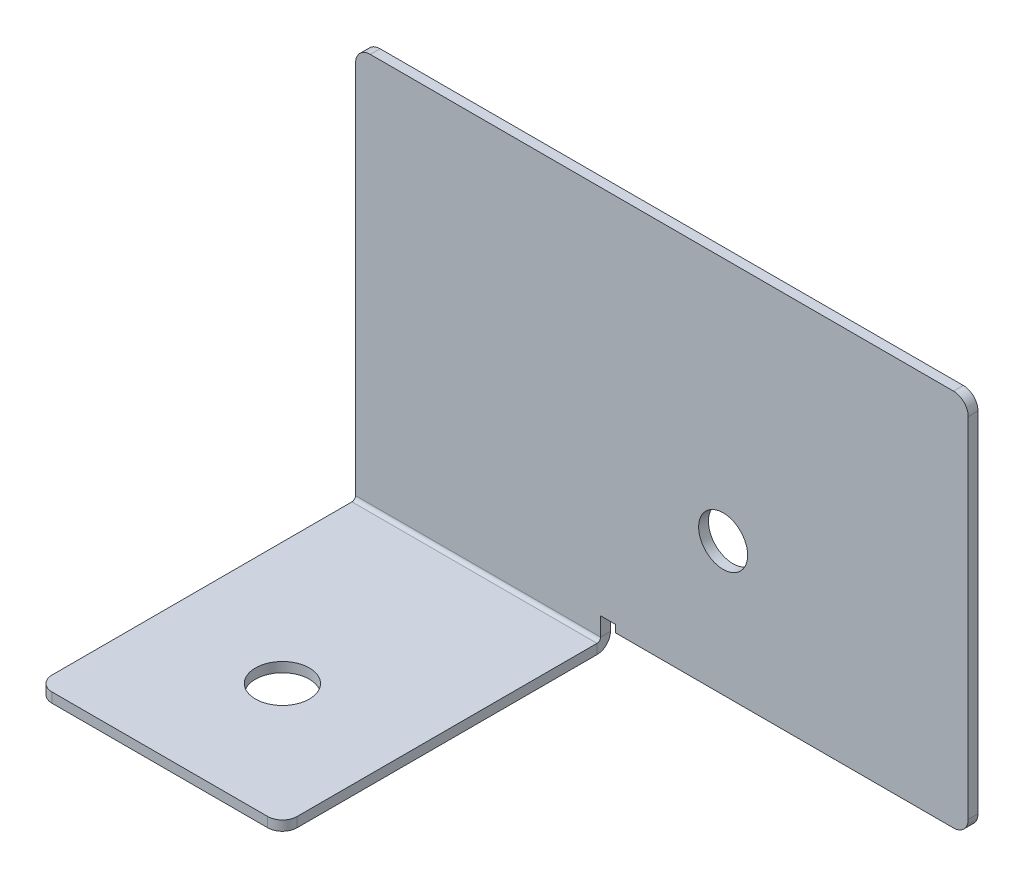
ISO-10303-21;
HEADER;
FILE_DESCRIPTION(('STEP AP214'),'2;1');
FILE_NAME('part.step','',(''),(''),'','','');
FILE_SCHEMA(('AUTOMOTIVE_DESIGN { 1 0 10303 214 1 1 1 1 }'));
ENDSEC;
DATA;
#1=APPLICATION_CONTEXT('core data for automotive mechanical design processes');
#2=APPLICATION_PROTOCOL_DEFINITION('international standard','automotive_design',2000,#1);
#3=PRODUCT_CONTEXT('',#1,'mechanical');
#4=PRODUCT('Part','Part','',(#3));
#5=PRODUCT_RELATED_PRODUCT_CATEGORY('part','',(#4));
#6=PRODUCT_DEFINITION_FORMATION('','',#4);
#7=PRODUCT_DEFINITION_CONTEXT('part definition',#1,'design');
#8=PRODUCT_DEFINITION('design','',#6,#7);
#9=PRODUCT_DEFINITION_SHAPE('','',#8);
#10=(LENGTH_UNIT() NAMED_UNIT(*) SI_UNIT(.MILLI.,.METRE.));
#11=(NAMED_UNIT(*) PLANE_ANGLE_UNIT() SI_UNIT($,.RADIAN.));
#12=(NAMED_UNIT(*) SI_UNIT($,.STERADIAN.) SOLID_ANGLE_UNIT());
#13=UNCERTAINTY_MEASURE_WITH_UNIT(LENGTH_MEASURE(1.E-05),#10,'distance_accuracy_value','');
#14=(GEOMETRIC_REPRESENTATION_CONTEXT(3) GLOBAL_UNCERTAINTY_ASSIGNED_CONTEXT((#13)) GLOBAL_UNIT_ASSIGNED_CONTEXT((#10,
#11,#12)) REPRESENTATION_CONTEXT('',''));
#15=CARTESIAN_POINT('',(0.,0.,0.));
#16=DIRECTION('',(0.,0.,1.));
#17=DIRECTION('',(1.,0.,0.));
#18=AXIS2_PLACEMENT_3D('',#15,#16,#17);
#19=CARTESIAN_POINT('',(62.5,38.6,-2.));
#20=DIRECTION('',(0.,1.,0.));
#21=DIRECTION('',(-1.,0.,0.));
#22=AXIS2_PLACEMENT_3D('',#19,#20,#21);
#23=PLANE('',#22);
#24=DIRECTION('',(-1.,0.,0.));
#25=VECTOR('',#24,1.);
#26=CARTESIAN_POINT('',(62.5,38.6,0.));
#27=LINE('',#26,#25);
#28=CARTESIAN_POINT('',(59.5,38.6,0.));
#29=VERTEX_POINT('',#28);
#30=CARTESIAN_POINT('',(-59.5,38.6,0.));
#31=VERTEX_POINT('',#30);
#32=EDGE_CURVE('E262',#29,#31,#27,.T.);
#33=ORIENTED_EDGE('',*,*,#32,.F.);
#34=DIRECTION('',(0.,0.,1.));
#35=VECTOR('',#34,1.);
#36=CARTESIAN_POINT('',(59.5,38.6,-2.));
#37=LINE('',#36,#35);
#38=CARTESIAN_POINT('',(59.5,38.6,-2.));
#39=VERTEX_POINT('',#38);
#40=EDGE_CURVE('E71',#29,#39,#37,.F.);
#41=ORIENTED_EDGE('',*,*,#40,.T.);
#42=DIRECTION('',(-1.,0.,0.));
#43=VECTOR('',#42,1.);
#44=CARTESIAN_POINT('',(62.5,38.6,-2.));
#45=LINE('',#44,#43);
#46=CARTESIAN_POINT('',(-59.5,38.6,-2.));
#47=VERTEX_POINT('',#46);
#48=EDGE_CURVE('E274',#39,#47,#45,.T.);
#49=ORIENTED_EDGE('',*,*,#48,.T.);
#50=DIRECTION('',(0.,0.,1.));
#51=VECTOR('',#50,1.);
#52=CARTESIAN_POINT('',(-59.5,38.6,0.));
#53=LINE('',#52,#51);
#54=EDGE_CURVE('E329',#47,#31,#53,.T.);
#55=ORIENTED_EDGE('',*,*,#54,.T.);
#56=EDGE_LOOP('',(#33,#41,#49,#55));
#57=FACE_BOUND('',#56,.T.);
#58=ADVANCED_FACE('F63',(#57),#23,.T.);
#59=CARTESIAN_POINT('',(62.5,-38.6,-2.));
#60=DIRECTION('',(1.,0.,0.));
#61=DIRECTION('',(0.,0.,-1.));
#62=AXIS2_PLACEMENT_3D('',#59,#60,#61);
#63=PLANE('',#62);
#64=DIRECTION('',(0.,1.,0.));
#65=VECTOR('',#64,1.);
#66=CARTESIAN_POINT('',(62.5,-38.6,0.));
#67=LINE('',#66,#65);
#68=CARTESIAN_POINT('',(62.5,-35.6,0.));
#69=VERTEX_POINT('',#68);
#70=CARTESIAN_POINT('',(62.5,35.6,0.));
#71=VERTEX_POINT('',#70);
#72=EDGE_CURVE('E277',#69,#71,#67,.T.);
#73=ORIENTED_EDGE('',*,*,#72,.F.);
#74=DIRECTION('',(0.,0.,1.));
#75=VECTOR('',#74,1.);
#76=CARTESIAN_POINT('',(62.5,-35.6,-2.));
#77=LINE('',#76,#75);
#78=CARTESIAN_POINT('',(62.5,-35.6,-2.));
#79=VERTEX_POINT('',#78);
#80=EDGE_CURVE('E322',#69,#79,#77,.F.);
#81=ORIENTED_EDGE('',*,*,#80,.T.);
#82=DIRECTION('',(0.,1.,0.));
#83=VECTOR('',#82,1.);
#84=CARTESIAN_POINT('',(62.5,-38.6,-2.));
#85=LINE('',#84,#83);
#86=CARTESIAN_POINT('',(62.5,35.6,-2.));
#87=VERTEX_POINT('',#86);
#88=EDGE_CURVE('E281',#79,#87,#85,.T.);
#89=ORIENTED_EDGE('',*,*,#88,.T.);
#90=DIRECTION('',(0.,0.,1.));
#91=VECTOR('',#90,1.);
#92=CARTESIAN_POINT('',(62.5,35.6,-2.));
#93=LINE('',#92,#91);
#94=EDGE_CURVE('E319',#87,#71,#93,.T.);
#95=ORIENTED_EDGE('',*,*,#94,.T.);
#96=EDGE_LOOP('',(#73,#81,#89,#95));
#97=FACE_BOUND('',#96,.T.);
#98=ADVANCED_FACE('F343',(#97),#63,.T.);
#99=CARTESIAN_POINT('',(62.5,-38.6,-2.));
#100=DIRECTION('',(0.,1.,0.));
#101=DIRECTION('',(-1.,0.,0.));
#102=AXIS2_PLACEMENT_3D('',#99,#100,#101);
#103=PLANE('',#102);
#104=DIRECTION('',(-1.,0.,0.));
#105=VECTOR('',#104,1.);
#106=CARTESIAN_POINT('',(62.5,-38.6,-2.));
#107=LINE('',#106,#105);
#108=CARTESIAN_POINT('',(59.5,-38.6,-2.));
#109=VERTEX_POINT('',#108);
#110=CARTESIAN_POINT('',(-9.49999999999999,-38.6,-2.));
#111=VERTEX_POINT('',#110);
#112=EDGE_CURVE('E279',#109,#111,#107,.T.);
#113=ORIENTED_EDGE('',*,*,#112,.F.);
#114=DIRECTION('',(0.,0.,1.));
#115=VECTOR('',#114,1.);
#116=CARTESIAN_POINT('',(59.5,-38.6,0.));
#117=LINE('',#116,#115);
#118=CARTESIAN_POINT('',(59.5,-38.6,0.));
#119=VERTEX_POINT('',#118);
#120=EDGE_CURVE('E310',#109,#119,#117,.T.);
#121=ORIENTED_EDGE('',*,*,#120,.T.);
#122=DIRECTION('',(-1.,0.,0.));
#123=VECTOR('',#122,1.);
#124=CARTESIAN_POINT('',(62.5,-38.6,0.));
#125=LINE('',#124,#123);
#126=CARTESIAN_POINT('',(-9.49999999999999,-38.6,0.));
#127=VERTEX_POINT('',#126);
#128=EDGE_CURVE('E290',#119,#127,#125,.T.);
#129=ORIENTED_EDGE('',*,*,#128,.T.);
#130=DIRECTION('',(0.,0.,1.));
#131=VECTOR('',#130,1.);
#132=CARTESIAN_POINT('',(-9.49999999999999,-38.6,-5.35410196624968));
#133=LINE('',#132,#131);
#134=EDGE_CURVE('E253',#111,#127,#133,.T.);
#135=ORIENTED_EDGE('',*,*,#134,.F.);
#136=EDGE_LOOP('',(#113,#121,#129,#135));
#137=FACE_BOUND('',#136,.T.);
#138=ADVANCED_FACE('F353',(#137),#103,.F.);
#139=CARTESIAN_POINT('',(-62.5,-38.6,-2.));
#140=DIRECTION('',(1.,0.,0.));
#141=DIRECTION('',(0.,0.,-1.));
#142=AXIS2_PLACEMENT_3D('',#139,#140,#141);
#143=PLANE('',#142);
#144=DIRECTION('',(0.,1.,0.));
#145=VECTOR('',#144,1.);
#146=CARTESIAN_POINT('',(-62.5,-38.6,0.));
#147=LINE('',#146,#145);
#148=CARTESIAN_POINT('',(-62.5,-40.8634,0.));
#149=VERTEX_POINT('',#148);
#150=CARTESIAN_POINT('',(-62.5,35.6,0.));
#151=VERTEX_POINT('',#150);
#152=EDGE_CURVE('E287',#149,#151,#147,.T.);
#153=ORIENTED_EDGE('',*,*,#152,.T.);
#154=DIRECTION('',(0.,0.,1.));
#155=VECTOR('',#154,1.);
#156=CARTESIAN_POINT('',(-62.5,35.6,-2.));
#157=LINE('',#156,#155);
#158=CARTESIAN_POINT('',(-62.5,35.6,-2.));
#159=VERTEX_POINT('',#158);
#160=EDGE_CURVE('E13',#151,#159,#157,.F.);
#161=ORIENTED_EDGE('',*,*,#160,.T.);
#162=DIRECTION('',(0.,1.,0.));
#163=VECTOR('',#162,1.);
#164=CARTESIAN_POINT('',(-62.5,-38.6,-2.));
#165=LINE('',#164,#163);
#166=CARTESIAN_POINT('',(-62.5,-40.8634,-1.99999999999999));
#167=VERTEX_POINT('',#166);
#168=EDGE_CURVE('E276',#167,#159,#165,.T.);
#169=ORIENTED_EDGE('',*,*,#168,.F.);
#170=DIRECTION('',(0.,0.,-1.));
#171=VECTOR('',#170,1.);
#172=CARTESIAN_POINT('',(-62.5,-40.8634,0.));
#173=LINE('',#172,#171);
#174=EDGE_CURVE('E244',#149,#167,#173,.T.);
#175=ORIENTED_EDGE('',*,*,#174,.F.);
#176=EDGE_LOOP('',(#153,#161,#169,#175));
#177=FACE_BOUND('',#176,.T.);
#178=ADVANCED_FACE('F413',(#177),#143,.F.);
#179=CARTESIAN_POINT('',(0.,0.,-2.));
#180=DIRECTION('',(0.,0.,-1.));
#181=DIRECTION('',(-1.,0.,0.));
#182=AXIS2_PLACEMENT_3D('',#179,#180,#181);
#183=PLANE('',#182);
#184=CARTESIAN_POINT('',(12.5,-11.4,-2.));
#185=DIRECTION('',(0.,0.,-1.));
#186=DIRECTION('',(-1.,0.,0.));
#187=AXIS2_PLACEMENT_3D('',#184,#185,#186);
#188=CIRCLE('',#187,5.);
#189=CARTESIAN_POINT('',(7.5,-11.4,-2.));
#190=VERTEX_POINT('',#189);
#191=EDGE_CURVE('E234',#190,#190,#188,.F.);
#192=ORIENTED_EDGE('',*,*,#191,.T.);
#193=EDGE_LOOP('',(#192));
#194=FACE_BOUND('',#193,.T.);
#195=ORIENTED_EDGE('',*,*,#88,.F.);
#196=CARTESIAN_POINT('',(59.5,-35.6,-2.));
#197=DIRECTION('',(0.,0.,-1.));
#198=DIRECTION('',(-1.,0.,0.));
#199=AXIS2_PLACEMENT_3D('',#196,#197,#198);
#200=CIRCLE('',#199,3.);
#201=EDGE_CURVE('E327',#79,#109,#200,.T.);
#202=ORIENTED_EDGE('',*,*,#201,.T.);
#203=ORIENTED_EDGE('',*,*,#112,.T.);
#204=DIRECTION('',(0.,1.,0.));
#205=VECTOR('',#204,1.);
#206=CARTESIAN_POINT('',(-9.49999999999999,-38.6,-2.));
#207=LINE('',#206,#205);
#208=CARTESIAN_POINT('',(-9.49999999999999,-37.1,-2.));
#209=VERTEX_POINT('',#208);
#210=EDGE_CURVE('E265',#111,#209,#207,.T.);
#211=ORIENTED_EDGE('',*,*,#210,.T.);
#212=DIRECTION('',(1.,0.,0.));
#213=VECTOR('',#212,1.);
#214=CARTESIAN_POINT('',(-12.5,-37.1,-2.));
#215=LINE('',#214,#213);
#216=CARTESIAN_POINT('',(-12.5,-37.1,-2.));
#217=VERTEX_POINT('',#216);
#218=EDGE_CURVE('E254',#217,#209,#215,.T.);
#219=ORIENTED_EDGE('',*,*,#218,.F.);
#220=DIRECTION('',(0.,1.,0.));
#221=VECTOR('',#220,1.);
#222=CARTESIAN_POINT('',(-12.5,-38.6,-2.));
#223=LINE('',#222,#221);
#224=CARTESIAN_POINT('',(-12.5,-40.8634,-1.99999999999999));
#225=VERTEX_POINT('',#224);
#226=EDGE_CURVE('E247',#225,#217,#223,.T.);
#227=ORIENTED_EDGE('',*,*,#226,.F.);
#228=DIRECTION('',(1.,0.,0.));
#229=VECTOR('',#228,1.);
#230=CARTESIAN_POINT('',(-12.5,-40.8634,-1.99999999999999));
#231=LINE('',#230,#229);
#232=EDGE_CURVE('E189',#225,#167,#231,.F.);
#233=ORIENTED_EDGE('',*,*,#232,.T.);
#234=ORIENTED_EDGE('',*,*,#168,.T.);
#235=CARTESIAN_POINT('',(-59.5,35.6,-2.));
#236=DIRECTION('',(0.,0.,-1.));
#237=DIRECTION('',(-1.,0.,0.));
#238=AXIS2_PLACEMENT_3D('',#235,#236,#237);
#239=CIRCLE('',#238,3.);
#240=EDGE_CURVE('E78',#159,#47,#239,.T.);
#241=ORIENTED_EDGE('',*,*,#240,.T.);
#242=ORIENTED_EDGE('',*,*,#48,.F.);
#243=CARTESIAN_POINT('',(59.5,35.6,-2.));
#244=DIRECTION('',(0.,0.,-1.));
#245=DIRECTION('',(-1.,0.,0.));
#246=AXIS2_PLACEMENT_3D('',#243,#244,#245);
#247=CIRCLE('',#246,3.);
#248=EDGE_CURVE('E325',#39,#87,#247,.T.);
#249=ORIENTED_EDGE('',*,*,#248,.T.);
#250=EDGE_LOOP('',(#195,#202,#203,#211,#219,#227,#233,#234,#241,#242,#249));
#251=FACE_BOUND('',#250,.T.);
#252=ADVANCED_FACE('F347',(#194,#251),#183,.T.);
#253=CARTESIAN_POINT('',(0.,0.,0.));
#254=DIRECTION('',(0.,0.,-1.));
#255=DIRECTION('',(-1.,0.,0.));
#256=AXIS2_PLACEMENT_3D('',#253,#254,#255);
#257=PLANE('',#256);
#258=CARTESIAN_POINT('',(12.5,-11.4,0.));
#259=DIRECTION('',(0.,0.,1.));
#260=DIRECTION('',(1.,0.,0.));
#261=AXIS2_PLACEMENT_3D('',#258,#259,#260);
#262=CIRCLE('',#261,5.);
#263=CARTESIAN_POINT('',(17.5,-11.4,0.));
#264=VERTEX_POINT('',#263);
#265=EDGE_CURVE('E457',#264,#264,#262,.T.);
#266=ORIENTED_EDGE('',*,*,#265,.F.);
#267=EDGE_LOOP('',(#266));
#268=FACE_BOUND('',#267,.T.);
#269=ORIENTED_EDGE('',*,*,#128,.F.);
#270=CARTESIAN_POINT('',(59.5,-35.6,0.));
#271=DIRECTION('',(0.,0.,-1.));
#272=DIRECTION('',(-1.,0.,0.));
#273=AXIS2_PLACEMENT_3D('',#270,#271,#272);
#274=CIRCLE('',#273,3.);
#275=EDGE_CURVE('E317',#119,#69,#274,.F.);
#276=ORIENTED_EDGE('',*,*,#275,.T.);
#277=ORIENTED_EDGE('',*,*,#72,.T.);
#278=CARTESIAN_POINT('',(59.5,35.6,0.));
#279=DIRECTION('',(0.,0.,-1.));
#280=DIRECTION('',(-1.,0.,0.));
#281=AXIS2_PLACEMENT_3D('',#278,#279,#280);
#282=CIRCLE('',#281,3.);
#283=EDGE_CURVE('E315',#71,#29,#282,.F.);
#284=ORIENTED_EDGE('',*,*,#283,.T.);
#285=ORIENTED_EDGE('',*,*,#32,.T.);
#286=CARTESIAN_POINT('',(-59.5,35.6,0.));
#287=DIRECTION('',(0.,0.,-1.));
#288=DIRECTION('',(-1.,0.,0.));
#289=AXIS2_PLACEMENT_3D('',#286,#287,#288);
#290=CIRCLE('',#289,3.);
#291=EDGE_CURVE('E313',#31,#151,#290,.F.);
#292=ORIENTED_EDGE('',*,*,#291,.T.);
#293=ORIENTED_EDGE('',*,*,#152,.F.);
#294=DIRECTION('',(1.,0.,0.));
#295=VECTOR('',#294,1.);
#296=CARTESIAN_POINT('',(-12.5,-40.8634,0.));
#297=LINE('',#296,#295);
#298=CARTESIAN_POINT('',(-12.5,-40.8634,0.));
#299=VERTEX_POINT('',#298);
#300=EDGE_CURVE('E241',#299,#149,#297,.F.);
#301=ORIENTED_EDGE('',*,*,#300,.F.);
#302=DIRECTION('',(0.,1.,0.));
#303=VECTOR('',#302,1.);
#304=CARTESIAN_POINT('',(-12.5,-38.6,0.));
#305=LINE('',#304,#303);
#306=CARTESIAN_POINT('',(-12.5,-37.1,0.));
#307=VERTEX_POINT('',#306);
#308=EDGE_CURVE('E258',#299,#307,#305,.T.);
#309=ORIENTED_EDGE('',*,*,#308,.T.);
#310=DIRECTION('',(1.,0.,0.));
#311=VECTOR('',#310,1.);
#312=CARTESIAN_POINT('',(-12.5,-37.1,0.));
#313=LINE('',#312,#311);
#314=CARTESIAN_POINT('',(-9.49999999999999,-37.1,0.));
#315=VERTEX_POINT('',#314);
#316=EDGE_CURVE('E255',#307,#315,#313,.T.);
#317=ORIENTED_EDGE('',*,*,#316,.T.);
#318=DIRECTION('',(0.,1.,0.));
#319=VECTOR('',#318,1.);
#320=CARTESIAN_POINT('',(-9.49999999999999,-38.6,0.));
#321=LINE('',#320,#319);
#322=EDGE_CURVE('E250',#127,#315,#321,.T.);
#323=ORIENTED_EDGE('',*,*,#322,.F.);
#324=EDGE_LOOP('',(#269,#276,#277,#284,#285,#292,#293,#301,#309,#317,#323));
#325=FACE_BOUND('',#324,.T.);
#326=ADVANCED_FACE('F335',(#268,#325),#257,.F.);
#327=CARTESIAN_POINT('',(-9.49999999999999,-38.6,-5.35410196624968));
#328=DIRECTION('',(1.,0.,0.));
#329=DIRECTION('',(0.,0.,-1.));
#330=AXIS2_PLACEMENT_3D('',#327,#328,#329);
#331=PLANE('',#330);
#332=ORIENTED_EDGE('',*,*,#134,.T.);
#333=ORIENTED_EDGE('',*,*,#322,.T.);
#334=DIRECTION('',(0.,0.,1.));
#335=VECTOR('',#334,1.);
#336=CARTESIAN_POINT('',(-9.49999999999999,-37.1,-5.35410196624968));
#337=LINE('',#336,#335);
#338=EDGE_CURVE('E268',#209,#315,#337,.T.);
#339=ORIENTED_EDGE('',*,*,#338,.F.);
#340=ORIENTED_EDGE('',*,*,#210,.F.);
#341=EDGE_LOOP('',(#332,#333,#339,#340));
#342=FACE_BOUND('',#341,.T.);
#343=ADVANCED_FACE('F358',(#342),#331,.F.);
#344=CARTESIAN_POINT('',(-12.5,-37.1,-5.35410196624968));
#345=DIRECTION('',(0.,-1.,0.));
#346=DIRECTION('',(0.,0.,-1.));
#347=AXIS2_PLACEMENT_3D('',#344,#345,#346);
#348=PLANE('',#347);
#349=ORIENTED_EDGE('',*,*,#218,.T.);
#350=ORIENTED_EDGE('',*,*,#338,.T.);
#351=ORIENTED_EDGE('',*,*,#316,.F.);
#352=DIRECTION('',(0.,0.,1.));
#353=VECTOR('',#352,1.);
#354=CARTESIAN_POINT('',(-12.5,-37.1,-5.35410196624968));
#355=LINE('',#354,#353);
#356=EDGE_CURVE('E259',#217,#307,#355,.T.);
#357=ORIENTED_EDGE('',*,*,#356,.F.);
#358=EDGE_LOOP('',(#349,#350,#351,#357));
#359=FACE_BOUND('',#358,.T.);
#360=ADVANCED_FACE('F363',(#359),#348,.T.);
#361=CARTESIAN_POINT('',(-12.5,-38.6,-5.35410196624968));
#362=DIRECTION('',(1.,0.,0.));
#363=DIRECTION('',(0.,0.,-1.));
#364=AXIS2_PLACEMENT_3D('',#361,#362,#363);
#365=PLANE('',#364);
#366=ORIENTED_EDGE('',*,*,#226,.T.);
#367=ORIENTED_EDGE('',*,*,#356,.T.);
#368=ORIENTED_EDGE('',*,*,#308,.F.);
#369=DIRECTION('',(0.,0.,-1.));
#370=VECTOR('',#369,1.);
#371=CARTESIAN_POINT('',(-12.5,-40.8634,0.));
#372=LINE('',#371,#370);
#373=EDGE_CURVE('E237',#299,#225,#372,.T.);
#374=ORIENTED_EDGE('',*,*,#373,.T.);
#375=EDGE_LOOP('',(#366,#367,#368,#374));
#376=FACE_BOUND('',#375,.T.);
#377=ADVANCED_FACE('F366',(#376),#365,.T.);
#378=CARTESIAN_POINT('',(-62.5,-40.8634,0.7366));
#379=DIRECTION('',(-1.,0.,0.));
#380=DIRECTION('',(0.,0.,1.));
#381=AXIS2_PLACEMENT_3D('',#378,#379,#380);
#382=PLANE('',#381);
#383=DIRECTION('',(0.,1.,0.));
#384=VECTOR('',#383,1.);
#385=CARTESIAN_POINT('',(-62.5,-43.6,0.73659999999999));
#386=LINE('',#385,#384);
#387=CARTESIAN_POINT('',(-62.5,-41.6,0.736599999999997));
#388=VERTEX_POINT('',#387);
#389=CARTESIAN_POINT('',(-62.5,-43.6,0.73659999999999));
#390=VERTEX_POINT('',#389);
#391=EDGE_CURVE('E231',#388,#390,#386,.F.);
#392=ORIENTED_EDGE('',*,*,#391,.F.);
#393=CARTESIAN_POINT('',(-62.5,-40.8634,0.7366));
#394=DIRECTION('',(1.,0.,0.));
#395=DIRECTION('',(0.,0.,-1.));
#396=AXIS2_PLACEMENT_3D('',#393,#394,#395);
#397=CIRCLE('',#396,0.73659999999999);
#398=EDGE_CURVE('E192',#149,#388,#397,.F.);
#399=ORIENTED_EDGE('',*,*,#398,.F.);
#400=ORIENTED_EDGE('',*,*,#174,.T.);
#401=CARTESIAN_POINT('',(-62.5,-40.8634,0.7366));
#402=DIRECTION('',(1.,0.,0.));
#403=DIRECTION('',(0.,0.,-1.));
#404=AXIS2_PLACEMENT_3D('',#401,#402,#403);
#405=CIRCLE('',#404,2.73659999999999);
#406=EDGE_CURVE('E236',#167,#390,#405,.F.);
#407=ORIENTED_EDGE('',*,*,#406,.T.);
#408=EDGE_LOOP('',(#392,#399,#400,#407));
#409=FACE_BOUND('',#408,.T.);
#410=ADVANCED_FACE('F375',(#409),#382,.T.);
#411=CARTESIAN_POINT('',(-12.5,-40.8634,0.7366));
#412=DIRECTION('',(-1.,0.,0.));
#413=DIRECTION('',(0.,0.,1.));
#414=AXIS2_PLACEMENT_3D('',#411,#412,#413);
#415=PLANE('',#414);
#416=CARTESIAN_POINT('',(-12.5,-40.8634,0.7366));
#417=DIRECTION('',(1.,0.,0.));
#418=DIRECTION('',(0.,0.,-1.));
#419=AXIS2_PLACEMENT_3D('',#416,#417,#418);
#420=CIRCLE('',#419,0.73659999999999);
#421=CARTESIAN_POINT('',(-12.5,-41.6,0.736599999999997));
#422=VERTEX_POINT('',#421);
#423=EDGE_CURVE('E199',#422,#299,#420,.T.);
#424=ORIENTED_EDGE('',*,*,#423,.F.);
#425=DIRECTION('',(0.,1.,0.));
#426=VECTOR('',#425,1.);
#427=CARTESIAN_POINT('',(-12.5,-41.6,0.736599999999997));
#428=LINE('',#427,#426);
#429=CARTESIAN_POINT('',(-12.5,-43.6,0.73659999999999));
#430=VERTEX_POINT('',#429);
#431=EDGE_CURVE('E196',#422,#430,#428,.F.);
#432=ORIENTED_EDGE('',*,*,#431,.T.);
#433=CARTESIAN_POINT('',(-12.5,-40.8634,0.7366));
#434=DIRECTION('',(1.,0.,0.));
#435=DIRECTION('',(0.,0.,-1.));
#436=AXIS2_PLACEMENT_3D('',#433,#434,#435);
#437=CIRCLE('',#436,2.73659999999999);
#438=EDGE_CURVE('E182',#430,#225,#437,.T.);
#439=ORIENTED_EDGE('',*,*,#438,.T.);
#440=ORIENTED_EDGE('',*,*,#373,.F.);
#441=EDGE_LOOP('',(#424,#432,#439,#440));
#442=FACE_BOUND('',#441,.T.);
#443=ADVANCED_FACE('F197',(#442),#415,.F.);
#444=CARTESIAN_POINT('',(-12.5,-40.8634,0.7366));
#445=DIRECTION('',(1.,0.,0.));
#446=DIRECTION('',(0.,-1.,0.));
#447=AXIS2_PLACEMENT_3D('',#444,#445,#446);
#448=CYLINDRICAL_SURFACE('',#447,2.73659999999999);
#449=ORIENTED_EDGE('',*,*,#232,.F.);
#450=ORIENTED_EDGE('',*,*,#438,.F.);
#451=DIRECTION('',(1.,0.,0.));
#452=VECTOR('',#451,1.);
#453=CARTESIAN_POINT('',(-62.5,-43.6,0.73659999999999));
#454=LINE('',#453,#452);
#455=EDGE_CURVE('E186',#430,#390,#454,.F.);
#456=ORIENTED_EDGE('',*,*,#455,.T.);
#457=ORIENTED_EDGE('',*,*,#406,.F.);
#458=EDGE_LOOP('',(#449,#450,#456,#457));
#459=FACE_BOUND('',#458,.T.);
#460=ADVANCED_FACE('F184',(#459),#448,.T.);
#461=CARTESIAN_POINT('',(-12.5,-40.8634,0.7366));
#462=DIRECTION('',(1.,0.,0.));
#463=DIRECTION('',(0.,-1.,0.));
#464=AXIS2_PLACEMENT_3D('',#461,#462,#463);
#465=CYLINDRICAL_SURFACE('',#464,0.73659999999999);
#466=ORIENTED_EDGE('',*,*,#300,.T.);
#467=ORIENTED_EDGE('',*,*,#398,.T.);
#468=DIRECTION('',(1.,0.,0.));
#469=VECTOR('',#468,1.);
#470=CARTESIAN_POINT('',(-62.5,-41.6,0.736599999999997));
#471=LINE('',#470,#469);
#472=EDGE_CURVE('E204',#388,#422,#471,.T.);
#473=ORIENTED_EDGE('',*,*,#472,.T.);
#474=ORIENTED_EDGE('',*,*,#423,.T.);
#475=EDGE_LOOP('',(#466,#467,#473,#474));
#476=FACE_BOUND('',#475,.T.);
#477=ADVANCED_FACE('F371',(#476),#465,.F.);
#478=CARTESIAN_POINT('',(-12.5,-43.6000000000002,64.925));
#479=DIRECTION('',(-1.,0.,0.));
#480=DIRECTION('',(0.,0.,1.));
#481=AXIS2_PLACEMENT_3D('',#478,#479,#480);
#482=PLANE('',#481);
#483=DIRECTION('',(0.,0.,-1.));
#484=VECTOR('',#483,1.);
#485=CARTESIAN_POINT('',(-12.5,-41.6000000000002,64.925));
#486=LINE('',#485,#484);
#487=CARTESIAN_POINT('',(-12.5,-41.6000000000002,61.925));
#488=VERTEX_POINT('',#487);
#489=EDGE_CURVE('E214',#422,#488,#486,.F.);
#490=ORIENTED_EDGE('',*,*,#489,.T.);
#491=DIRECTION('',(0.,1.,0.));
#492=VECTOR('',#491,1.);
#493=CARTESIAN_POINT('',(-12.5,-43.6000000000002,61.925));
#494=LINE('',#493,#492);
#495=CARTESIAN_POINT('',(-12.5,-43.6000000000002,61.925));
#496=VERTEX_POINT('',#495);
#497=EDGE_CURVE('E218',#488,#496,#494,.F.);
#498=ORIENTED_EDGE('',*,*,#497,.T.);
#499=DIRECTION('',(0.,0.,1.));
#500=VECTOR('',#499,1.);
#501=CARTESIAN_POINT('',(-12.5,-43.6,-1.41667507886834E-13));
#502=LINE('',#501,#500);
#503=EDGE_CURVE('E210',#430,#496,#502,.T.);
#504=ORIENTED_EDGE('',*,*,#503,.F.);
#505=ORIENTED_EDGE('',*,*,#431,.F.);
#506=EDGE_LOOP('',(#490,#498,#504,#505));
#507=FACE_BOUND('',#506,.T.);
#508=ADVANCED_FACE('F216',(#507),#482,.F.);
#509=CARTESIAN_POINT('',(-62.5,-43.6,0.));
#510=DIRECTION('',(1.,0.,0.));
#511=DIRECTION('',(0.,1.,0.));
#512=AXIS2_PLACEMENT_3D('',#509,#510,#511);
#513=PLANE('',#512);
#514=DIRECTION('',(0.,0.,-1.));
#515=VECTOR('',#514,1.);
#516=CARTESIAN_POINT('',(-62.5,-43.6,-1.38995619591143E-13));
#517=LINE('',#516,#515);
#518=CARTESIAN_POINT('',(-62.5,-43.6000000000002,61.925));
#519=VERTEX_POINT('',#518);
#520=EDGE_CURVE('E213',#519,#390,#517,.T.);
#521=ORIENTED_EDGE('',*,*,#520,.F.);
#522=DIRECTION('',(0.,1.,0.));
#523=VECTOR('',#522,1.);
#524=CARTESIAN_POINT('',(-62.5,-43.6000000000002,61.925));
#525=LINE('',#524,#523);
#526=CARTESIAN_POINT('',(-62.5,-41.6000000000002,61.925));
#527=VERTEX_POINT('',#526);
#528=EDGE_CURVE('E284',#519,#527,#525,.T.);
#529=ORIENTED_EDGE('',*,*,#528,.T.);
#530=DIRECTION('',(0.,0.,1.));
#531=VECTOR('',#530,1.);
#532=CARTESIAN_POINT('',(-62.5,-41.6,0.));
#533=LINE('',#532,#531);
#534=EDGE_CURVE('E220',#527,#388,#533,.F.);
#535=ORIENTED_EDGE('',*,*,#534,.T.);
#536=ORIENTED_EDGE('',*,*,#391,.T.);
#537=EDGE_LOOP('',(#521,#529,#535,#536));
#538=FACE_BOUND('',#537,.T.);
#539=ADVANCED_FACE('F378',(#538),#513,.F.);
#540=CARTESIAN_POINT('',(0.,-43.6,-1.38995619591143E-13));
#541=DIRECTION('',(0.,1.,0.));
#542=DIRECTION('',(0.,0.,1.));
#543=AXIS2_PLACEMENT_3D('',#540,#541,#542);
#544=PLANE('',#543);
#545=CARTESIAN_POINT('',(-37.5,-43.6000000000001,39.925));
#546=DIRECTION('',(0.,-1.,0.));
#547=DIRECTION('',(0.,0.,-1.));
#548=AXIS2_PLACEMENT_3D('',#545,#546,#547);
#549=CIRCLE('',#548,5.5);
#550=CARTESIAN_POINT('',(-37.5,-43.6000000000001,34.425));
#551=VERTEX_POINT('',#550);
#552=EDGE_CURVE('E466',#551,#551,#549,.T.);
#553=ORIENTED_EDGE('',*,*,#552,.F.);
#554=EDGE_LOOP('',(#553));
#555=FACE_BOUND('',#554,.T.);
#556=DIRECTION('',(-1.,0.,0.));
#557=VECTOR('',#556,1.);
#558=CARTESIAN_POINT('',(0.,-43.6000000000002,64.925));
#559=LINE('',#558,#557);
#560=CARTESIAN_POINT('',(-15.5,-43.6000000000002,64.925));
#561=VERTEX_POINT('',#560);
#562=CARTESIAN_POINT('',(-59.5,-43.6000000000002,64.925));
#563=VERTEX_POINT('',#562);
#564=EDGE_CURVE('E219',#561,#563,#559,.T.);
#565=ORIENTED_EDGE('',*,*,#564,.T.);
#566=CARTESIAN_POINT('',(-59.5,-43.6000000000002,61.925));
#567=DIRECTION('',(0.,1.,0.));
#568=DIRECTION('',(0.,0.,1.));
#569=AXIS2_PLACEMENT_3D('',#566,#567,#568);
#570=CIRCLE('',#569,3.);
#571=EDGE_CURVE('E307',#563,#519,#570,.F.);
#572=ORIENTED_EDGE('',*,*,#571,.T.);
#573=ORIENTED_EDGE('',*,*,#520,.T.);
#574=ORIENTED_EDGE('',*,*,#455,.F.);
#575=ORIENTED_EDGE('',*,*,#503,.T.);
#576=CARTESIAN_POINT('',(-15.5,-43.6000000000002,61.925));
#577=DIRECTION('',(0.,1.,0.));
#578=DIRECTION('',(0.,0.,1.));
#579=AXIS2_PLACEMENT_3D('',#576,#577,#578);
#580=CIRCLE('',#579,3.);
#581=EDGE_CURVE('E305',#496,#561,#580,.F.);
#582=ORIENTED_EDGE('',*,*,#581,.T.);
#583=EDGE_LOOP('',(#565,#572,#573,#574,#575,#582));
#584=FACE_BOUND('',#583,.T.);
#585=ADVANCED_FACE('F209',(#555,#584),#544,.F.);
#586=CARTESIAN_POINT('',(0.,-41.6,-1.32012656913457E-13));
#587=DIRECTION('',(0.,1.,0.));
#588=DIRECTION('',(0.,0.,1.));
#589=AXIS2_PLACEMENT_3D('',#586,#587,#588);
#590=PLANE('',#589);
#591=CARTESIAN_POINT('',(-37.5,-41.6000000000001,39.925));
#592=DIRECTION('',(0.,1.,0.));
#593=DIRECTION('',(0.,0.,1.));
#594=AXIS2_PLACEMENT_3D('',#591,#592,#593);
#595=CIRCLE('',#594,5.5);
#596=CARTESIAN_POINT('',(-37.5,-41.6000000000001,34.425));
#597=VERTEX_POINT('',#596);
#598=EDGE_CURVE('E461',#597,#597,#595,.F.);
#599=ORIENTED_EDGE('',*,*,#598,.T.);
#600=EDGE_LOOP('',(#599));
#601=FACE_BOUND('',#600,.T.);
#602=ORIENTED_EDGE('',*,*,#534,.F.);
#603=CARTESIAN_POINT('',(-59.5,-41.6000000000002,61.925));
#604=DIRECTION('',(0.,1.,0.));
#605=DIRECTION('',(0.,0.,1.));
#606=AXIS2_PLACEMENT_3D('',#603,#604,#605);
#607=CIRCLE('',#606,3.);
#608=CARTESIAN_POINT('',(-59.5,-41.6000000000002,64.925));
#609=VERTEX_POINT('',#608);
#610=EDGE_CURVE('E298',#527,#609,#607,.T.);
#611=ORIENTED_EDGE('',*,*,#610,.T.);
#612=DIRECTION('',(1.,0.,0.));
#613=VECTOR('',#612,1.);
#614=CARTESIAN_POINT('',(-62.5,-41.6000000000002,64.925));
#615=LINE('',#614,#613);
#616=CARTESIAN_POINT('',(-15.5,-41.6000000000002,64.925));
#617=VERTEX_POINT('',#616);
#618=EDGE_CURVE('E223',#617,#609,#615,.F.);
#619=ORIENTED_EDGE('',*,*,#618,.F.);
#620=CARTESIAN_POINT('',(-15.5,-41.6000000000002,61.925));
#621=DIRECTION('',(0.,1.,0.));
#622=DIRECTION('',(0.,0.,1.));
#623=AXIS2_PLACEMENT_3D('',#620,#621,#622);
#624=CIRCLE('',#623,3.);
#625=EDGE_CURVE('E296',#617,#488,#624,.T.);
#626=ORIENTED_EDGE('',*,*,#625,.T.);
#627=ORIENTED_EDGE('',*,*,#489,.F.);
#628=ORIENTED_EDGE('',*,*,#472,.F.);
#629=EDGE_LOOP('',(#602,#611,#619,#626,#627,#628));
#630=FACE_BOUND('',#629,.T.);
#631=ADVANCED_FACE('F382',(#601,#630),#590,.T.);
#632=CARTESIAN_POINT('',(-62.5,-43.6000000000002,64.925));
#633=DIRECTION('',(0.,0.,-1.));
#634=DIRECTION('',(0.,1.,0.));
#635=AXIS2_PLACEMENT_3D('',#632,#633,#634);
#636=PLANE('',#635);
#637=ORIENTED_EDGE('',*,*,#618,.T.);
#638=DIRECTION('',(0.,1.,0.));
#639=VECTOR('',#638,1.);
#640=CARTESIAN_POINT('',(-59.5,-43.6000000000002,64.925));
#641=LINE('',#640,#639);
#642=EDGE_CURVE('E303',#609,#563,#641,.F.);
#643=ORIENTED_EDGE('',*,*,#642,.T.);
#644=ORIENTED_EDGE('',*,*,#564,.F.);
#645=DIRECTION('',(0.,1.,0.));
#646=VECTOR('',#645,1.);
#647=CARTESIAN_POINT('',(-15.5,-43.6000000000002,64.925));
#648=LINE('',#647,#646);
#649=EDGE_CURVE('E300',#561,#617,#648,.T.);
#650=ORIENTED_EDGE('',*,*,#649,.T.);
#651=EDGE_LOOP('',(#637,#643,#644,#650));
#652=FACE_BOUND('',#651,.T.);
#653=ADVANCED_FACE('F390',(#652),#636,.F.);
#654=CARTESIAN_POINT('',(12.5,-11.4,-16.1421356237309));
#655=DIRECTION('',(0.,0.,1.));
#656=DIRECTION('',(1.,0.,0.));
#657=AXIS2_PLACEMENT_3D('',#654,#655,#656);
#658=CYLINDRICAL_SURFACE('',#657,5.);
#659=ORIENTED_EDGE('',*,*,#265,.T.);
#660=EDGE_LOOP('',(#659));
#661=FACE_BOUND('',#660,.T.);
#662=ORIENTED_EDGE('',*,*,#191,.F.);
#663=EDGE_LOOP('',(#662));
#664=FACE_BOUND('',#663,.T.);
#665=ADVANCED_FACE('F403',(#661,#664),#658,.F.);
#666=CARTESIAN_POINT('',(-37.5,-26.0436508138961,39.9250000000001));
#667=DIRECTION('',(0.,-1.,0.));
#668=DIRECTION('',(0.,0.,-1.));
#669=AXIS2_PLACEMENT_3D('',#666,#667,#668);
#670=CYLINDRICAL_SURFACE('',#669,5.5);
#671=CARTESIAN_POINT('',(-37.5,-43.6000000000001,34.425));
#672=CARTESIAN_POINT('',(-37.5,-43.5791666666668,34.425));
#673=CARTESIAN_POINT('',(-37.5,-43.5583333333335,34.425));
#674=CARTESIAN_POINT('',(-37.5,-43.5166666666668,34.425));
#675=CARTESIAN_POINT('',(-37.5,-43.4958333333335,34.425));
#676=CARTESIAN_POINT('',(-37.5,-43.4541666666668,34.425));
#677=CARTESIAN_POINT('',(-37.5,-43.4333333333335,34.425));
#678=CARTESIAN_POINT('',(-37.5,-43.3916666666668,34.425));
#679=CARTESIAN_POINT('',(-37.5,-43.3708333333335,34.425));
#680=CARTESIAN_POINT('',(-37.5,-43.3291666666668,34.425));
#681=CARTESIAN_POINT('',(-37.5,-43.3083333333335,34.425));
#682=CARTESIAN_POINT('',(-37.5,-43.2666666666668,34.425));
#683=CARTESIAN_POINT('',(-37.5,-43.2458333333335,34.425));
#684=CARTESIAN_POINT('',(-37.5,-43.2041666666668,34.425));
#685=CARTESIAN_POINT('',(-37.5,-43.1833333333335,34.425));
#686=CARTESIAN_POINT('',(-37.5,-43.1416666666668,34.425));
#687=CARTESIAN_POINT('',(-37.5,-43.1208333333335,34.425));
#688=CARTESIAN_POINT('',(-37.5,-43.0791666666668,34.425));
#689=CARTESIAN_POINT('',(-37.5,-43.0583333333335,34.425));
#690=CARTESIAN_POINT('',(-37.5,-43.0166666666668,34.425));
#691=CARTESIAN_POINT('',(-37.5,-42.9958333333335,34.425));
#692=CARTESIAN_POINT('',(-37.5,-42.9541666666668,34.425));
#693=CARTESIAN_POINT('',(-37.5,-42.9333333333335,34.425));
#694=CARTESIAN_POINT('',(-37.5,-42.8916666666668,34.425));
#695=CARTESIAN_POINT('',(-37.5,-42.8708333333335,34.425));
#696=CARTESIAN_POINT('',(-37.5,-42.8291666666668,34.425));
#697=CARTESIAN_POINT('',(-37.5,-42.8083333333335,34.425));
#698=CARTESIAN_POINT('',(-37.5,-42.7666666666668,34.425));
#699=CARTESIAN_POINT('',(-37.5,-42.7458333333335,34.425));
#700=CARTESIAN_POINT('',(-37.5,-42.7041666666668,34.425));
#701=CARTESIAN_POINT('',(-37.5,-42.6833333333335,34.425));
#702=CARTESIAN_POINT('',(-37.5,-42.6416666666668,34.425));
#703=CARTESIAN_POINT('',(-37.5,-42.6208333333335,34.425));
#704=CARTESIAN_POINT('',(-37.5,-42.5791666666668,34.425));
#705=CARTESIAN_POINT('',(-37.5,-42.5583333333335,34.425));
#706=CARTESIAN_POINT('',(-37.5,-42.5166666666668,34.425));
#707=CARTESIAN_POINT('',(-37.5,-42.4958333333335,34.425));
#708=CARTESIAN_POINT('',(-37.5,-42.4541666666668,34.425));
#709=CARTESIAN_POINT('',(-37.5,-42.4333333333335,34.425));
#710=CARTESIAN_POINT('',(-37.5,-42.3916666666668,34.425));
#711=CARTESIAN_POINT('',(-37.5,-42.3708333333335,34.425));
#712=CARTESIAN_POINT('',(-37.5,-42.3291666666668,34.425));
#713=CARTESIAN_POINT('',(-37.5,-42.3083333333335,34.425));
#714=CARTESIAN_POINT('',(-37.5,-42.2666666666668,34.425));
#715=CARTESIAN_POINT('',(-37.5,-42.2458333333335,34.425));
#716=CARTESIAN_POINT('',(-37.5,-42.2041666666668,34.425));
#717=CARTESIAN_POINT('',(-37.5,-42.1833333333335,34.425));
#718=CARTESIAN_POINT('',(-37.5,-42.1416666666668,34.425));
#719=CARTESIAN_POINT('',(-37.5,-42.1208333333335,34.425));
#720=CARTESIAN_POINT('',(-37.5,-42.0791666666668,34.425));
#721=CARTESIAN_POINT('',(-37.5,-42.0583333333335,34.425));
#722=CARTESIAN_POINT('',(-37.5,-42.0166666666668,34.425));
#723=CARTESIAN_POINT('',(-37.5,-41.9958333333335,34.425));
#724=CARTESIAN_POINT('',(-37.5,-41.9541666666668,34.425));
#725=CARTESIAN_POINT('',(-37.5,-41.9333333333335,34.425));
#726=CARTESIAN_POINT('',(-37.5,-41.8916666666668,34.425));
#727=CARTESIAN_POINT('',(-37.5,-41.8708333333335,34.425));
#728=CARTESIAN_POINT('',(-37.5,-41.8291666666668,34.425));
#729=CARTESIAN_POINT('',(-37.5,-41.8083333333335,34.425));
#730=CARTESIAN_POINT('',(-37.5,-41.7666666666668,34.425));
#731=CARTESIAN_POINT('',(-37.5,-41.7458333333334,34.425));
#732=CARTESIAN_POINT('',(-37.5,-41.7041666666668,34.425));
#733=CARTESIAN_POINT('',(-37.5,-41.6833333333334,34.425));
#734=CARTESIAN_POINT('',(-37.5,-41.6416666666668,34.425));
#735=CARTESIAN_POINT('',(-37.5,-41.6208333333334,34.425));
#736=CARTESIAN_POINT('',(-37.5,-41.6000000000001,34.425));
#737=B_SPLINE_CURVE_WITH_KNOTS('',3,(#671,#672,#673,#674,#675,#676,#677,#678,#679,#680,#681,
#682,#683,#684,#685,#686,#687,#688,#689,#690,#691,#692,#693,#694,#695,#696,#697,#698,#699,#700,
#701,#702,#703,#704,#705,#706,#707,#708,#709,#710,#711,#712,#713,#714,#715,#716,#717,#718,#719,
#720,#721,#722,#723,#724,#725,#726,#727,#728,#729,#730,#731,#732,#733,#734,#735,#736),
.UNSPECIFIED.,.F.,.F.,(4,2,2,2,2,2,2,2,2,2,2,2,2,2,2,2,2,2,2,2,2,2,2,2,2,2,2,2,2,2,2,2,4),(0.,
0.0625000000000001,0.125,0.1875,0.25,0.3125,0.375,0.4375,0.5,0.5625,0.625000000000001,
0.687500000000001,0.750000000000001,0.812500000000001,0.875000000000001,0.937500000000001,1.,
1.0625,1.125,1.1875,1.25,1.3125,1.375,1.4375,1.5,1.5625,1.625,1.6875,1.75,1.8125,1.875,1.9375,
2.),.UNSPECIFIED.);
#738=EDGE_CURVE('BSEAM395',#551,#597,#737,.T.);
#739=ORIENTED_EDGE('',*,*,#552,.T.);
#740=ORIENTED_EDGE('',*,*,#598,.F.);
#741=ORIENTED_EDGE('',*,*,#738,.T.);
#742=ORIENTED_EDGE('',*,*,#738,.F.);
#743=EDGE_LOOP('',(#739,#741,#740,#742));
#744=FACE_BOUND('',#743,.T.);
#745=ADVANCED_FACE('F395',(#744),#670,.F.);
#746=CARTESIAN_POINT('',(-59.5,-43.6000000000002,61.925));
#747=DIRECTION('',(0.,1.,0.));
#748=DIRECTION('',(0.,0.,1.));
#749=AXIS2_PLACEMENT_3D('',#746,#747,#748);
#750=CYLINDRICAL_SURFACE('',#749,3.);
#751=ORIENTED_EDGE('',*,*,#571,.F.);
#752=ORIENTED_EDGE('',*,*,#642,.F.);
#753=ORIENTED_EDGE('',*,*,#610,.F.);
#754=ORIENTED_EDGE('',*,*,#528,.F.);
#755=EDGE_LOOP('',(#751,#752,#753,#754));
#756=FACE_BOUND('',#755,.T.);
#757=ADVANCED_FACE('F393',(#756),#750,.T.);
#758=CARTESIAN_POINT('',(-15.5,-43.6000000000002,61.925));
#759=DIRECTION('',(0.,1.,0.));
#760=DIRECTION('',(0.,0.,1.));
#761=AXIS2_PLACEMENT_3D('',#758,#759,#760);
#762=CYLINDRICAL_SURFACE('',#761,3.);
#763=ORIENTED_EDGE('',*,*,#581,.F.);
#764=ORIENTED_EDGE('',*,*,#497,.F.);
#765=ORIENTED_EDGE('',*,*,#625,.F.);
#766=ORIENTED_EDGE('',*,*,#649,.F.);
#767=EDGE_LOOP('',(#763,#764,#765,#766));
#768=FACE_BOUND('',#767,.T.);
#769=ADVANCED_FACE('F385',(#768),#762,.T.);
#770=CARTESIAN_POINT('',(59.5,-35.6,-2.));
#771=DIRECTION('',(0.,0.,-1.));
#772=DIRECTION('',(-1.,0.,0.));
#773=AXIS2_PLACEMENT_3D('',#770,#771,#772);
#774=CYLINDRICAL_SURFACE('',#773,3.);
#775=ORIENTED_EDGE('',*,*,#201,.F.);
#776=ORIENTED_EDGE('',*,*,#80,.F.);
#777=ORIENTED_EDGE('',*,*,#275,.F.);
#778=ORIENTED_EDGE('',*,*,#120,.F.);
#779=EDGE_LOOP('',(#775,#776,#777,#778));
#780=FACE_BOUND('',#779,.T.);
#781=ADVANCED_FACE('F351',(#780),#774,.T.);
#782=CARTESIAN_POINT('',(59.5,35.6,-2.));
#783=DIRECTION('',(0.,0.,1.));
#784=DIRECTION('',(1.,0.,0.));
#785=AXIS2_PLACEMENT_3D('',#782,#783,#784);
#786=CYLINDRICAL_SURFACE('',#785,3.);
#787=ORIENTED_EDGE('',*,*,#248,.F.);
#788=ORIENTED_EDGE('',*,*,#40,.F.);
#789=ORIENTED_EDGE('',*,*,#283,.F.);
#790=ORIENTED_EDGE('',*,*,#94,.F.);
#791=EDGE_LOOP('',(#787,#788,#789,#790));
#792=FACE_BOUND('',#791,.T.);
#793=ADVANCED_FACE('F341',(#792),#786,.T.);
#794=CARTESIAN_POINT('',(-59.5,35.6,-2.));
#795=DIRECTION('',(0.,0.,-1.));
#796=DIRECTION('',(-1.,0.,0.));
#797=AXIS2_PLACEMENT_3D('',#794,#795,#796);
#798=CYLINDRICAL_SURFACE('',#797,3.);
#799=ORIENTED_EDGE('',*,*,#240,.F.);
#800=ORIENTED_EDGE('',*,*,#160,.F.);
#801=ORIENTED_EDGE('',*,*,#291,.F.);
#802=ORIENTED_EDGE('',*,*,#54,.F.);
#803=EDGE_LOOP('',(#799,#800,#801,#802));
#804=FACE_BOUND('',#803,.T.);
#805=ADVANCED_FACE('F65',(#804),#798,.T.);
#806=CLOSED_SHELL('',(#58,#98,#138,#178,#252,#326,#343,#360,#377,#410,#443,#460,#477,#508,#539,
#585,#631,#653,#665,#745,#757,#769,#781,#793,#805));
#807=MANIFOLD_SOLID_BREP('B2',#806);
#808=ADVANCED_BREP_SHAPE_REPRESENTATION('',(#18,#807),#14);
#809=SHAPE_DEFINITION_REPRESENTATION(#9,#808);
ENDSEC;
END-ISO-10303-21;
